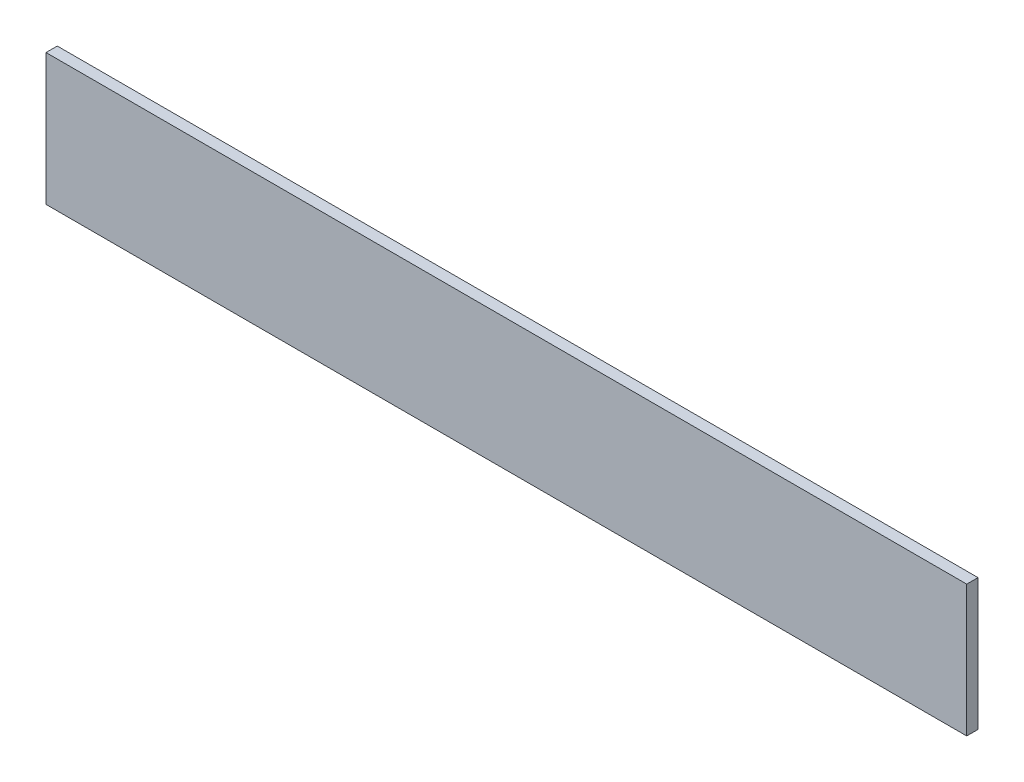
ISO-10303-21;
HEADER;
FILE_DESCRIPTION(('STEP AP214'),'2;1');
FILE_NAME('part.step','',(''),(''),'','','');
FILE_SCHEMA(('AUTOMOTIVE_DESIGN { 1 0 10303 214 1 1 1 1 }'));
ENDSEC;
DATA;
#1=APPLICATION_CONTEXT('core data for automotive mechanical design processes');
#2=APPLICATION_PROTOCOL_DEFINITION('international standard','automotive_design',2000,#1);
#3=PRODUCT_CONTEXT('',#1,'mechanical');
#4=PRODUCT('Part','Part','',(#3));
#5=PRODUCT_RELATED_PRODUCT_CATEGORY('part','',(#4));
#6=PRODUCT_DEFINITION_FORMATION('','',#4);
#7=PRODUCT_DEFINITION_CONTEXT('part definition',#1,'design');
#8=PRODUCT_DEFINITION('design','',#6,#7);
#9=PRODUCT_DEFINITION_SHAPE('','',#8);
#10=(LENGTH_UNIT() NAMED_UNIT(*) SI_UNIT(.MILLI.,.METRE.));
#11=(NAMED_UNIT(*) PLANE_ANGLE_UNIT() SI_UNIT($,.RADIAN.));
#12=(NAMED_UNIT(*) SI_UNIT($,.STERADIAN.) SOLID_ANGLE_UNIT());
#13=UNCERTAINTY_MEASURE_WITH_UNIT(LENGTH_MEASURE(1.E-05),#10,'distance_accuracy_value','');
#14=(GEOMETRIC_REPRESENTATION_CONTEXT(3) GLOBAL_UNCERTAINTY_ASSIGNED_CONTEXT((#13)) GLOBAL_UNIT_ASSIGNED_CONTEXT((#10,
#11,#12)) REPRESENTATION_CONTEXT('',''));
#15=CARTESIAN_POINT('',(0.,0.,0.));
#16=DIRECTION('',(0.,0.,1.));
#17=DIRECTION('',(1.,0.,0.));
#18=AXIS2_PLACEMENT_3D('',#15,#16,#17);
#19=CARTESIAN_POINT('',(0.,0.,3.));
#20=DIRECTION('',(-1.,0.,0.));
#21=DIRECTION('',(0.,-1.,0.));
#22=AXIS2_PLACEMENT_3D('',#19,#20,#21);
#23=PLANE('',#22);
#24=DIRECTION('',(0.,1.,0.));
#25=VECTOR('',#24,1.);
#26=CARTESIAN_POINT('',(0.,0.,0.));
#27=LINE('',#26,#25);
#28=CARTESIAN_POINT('',(0.,-35.,0.));
#29=VERTEX_POINT('',#28);
#30=CARTESIAN_POINT('',(0.,0.,0.));
#31=VERTEX_POINT('',#30);
#32=EDGE_CURVE('E100',#29,#31,#27,.T.);
#33=ORIENTED_EDGE('',*,*,#32,.T.);
#34=DIRECTION('',(0.,0.,-1.));
#35=VECTOR('',#34,1.);
#36=CARTESIAN_POINT('',(0.,0.,3.));
#37=LINE('',#36,#35);
#38=CARTESIAN_POINT('',(0.,0.,3.));
#39=VERTEX_POINT('',#38);
#40=EDGE_CURVE('E11',#39,#31,#37,.T.);
#41=ORIENTED_EDGE('',*,*,#40,.F.);
#42=DIRECTION('',(0.,1.,0.));
#43=VECTOR('',#42,1.);
#44=CARTESIAN_POINT('',(0.,0.,3.));
#45=LINE('',#44,#43);
#46=CARTESIAN_POINT('',(0.,-35.,3.));
#47=VERTEX_POINT('',#46);
#48=EDGE_CURVE('E88',#47,#39,#45,.T.);
#49=ORIENTED_EDGE('',*,*,#48,.F.);
#50=DIRECTION('',(0.,0.,-1.));
#51=VECTOR('',#50,1.);
#52=CARTESIAN_POINT('',(0.,-35.,3.));
#53=LINE('',#52,#51);
#54=EDGE_CURVE('E96',#47,#29,#53,.T.);
#55=ORIENTED_EDGE('',*,*,#54,.T.);
#56=EDGE_LOOP('',(#33,#41,#49,#55));
#57=FACE_BOUND('',#56,.T.);
#58=ADVANCED_FACE('F37',(#57),#23,.F.);
#59=CARTESIAN_POINT('',(0.,0.,3.));
#60=DIRECTION('',(0.,-1.,0.));
#61=DIRECTION('',(1.,0.,0.));
#62=AXIS2_PLACEMENT_3D('',#59,#60,#61);
#63=PLANE('',#62);
#64=DIRECTION('',(-1.,0.,0.));
#65=VECTOR('',#64,1.);
#66=CARTESIAN_POINT('',(0.,0.,0.));
#67=LINE('',#66,#65);
#68=CARTESIAN_POINT('',(-245.,0.,0.));
#69=VERTEX_POINT('',#68);
#70=EDGE_CURVE('E92',#31,#69,#67,.T.);
#71=ORIENTED_EDGE('',*,*,#70,.T.);
#72=DIRECTION('',(0.,0.,-1.));
#73=VECTOR('',#72,1.);
#74=CARTESIAN_POINT('',(-245.,0.,3.));
#75=LINE('',#74,#73);
#76=CARTESIAN_POINT('',(-245.,0.,3.));
#77=VERTEX_POINT('',#76);
#78=EDGE_CURVE('E45',#77,#69,#75,.T.);
#79=ORIENTED_EDGE('',*,*,#78,.F.);
#80=DIRECTION('',(-1.,0.,0.));
#81=VECTOR('',#80,1.);
#82=CARTESIAN_POINT('',(0.,0.,3.));
#83=LINE('',#82,#81);
#84=EDGE_CURVE('E83',#39,#77,#83,.T.);
#85=ORIENTED_EDGE('',*,*,#84,.F.);
#86=ORIENTED_EDGE('',*,*,#40,.T.);
#87=EDGE_LOOP('',(#71,#79,#85,#86));
#88=FACE_BOUND('',#87,.T.);
#89=ADVANCED_FACE('F91',(#88),#63,.F.);
#90=CARTESIAN_POINT('',(-245.,0.,3.));
#91=DIRECTION('',(1.,0.,0.));
#92=DIRECTION('',(0.,0.,-1.));
#93=AXIS2_PLACEMENT_3D('',#90,#91,#92);
#94=PLANE('',#93);
#95=DIRECTION('',(0.,-1.,0.));
#96=VECTOR('',#95,1.);
#97=CARTESIAN_POINT('',(-245.,0.,0.));
#98=LINE('',#97,#96);
#99=CARTESIAN_POINT('',(-245.,-35.,0.));
#100=VERTEX_POINT('',#99);
#101=EDGE_CURVE('E70',#69,#100,#98,.T.);
#102=ORIENTED_EDGE('',*,*,#101,.T.);
#103=DIRECTION('',(0.,0.,-1.));
#104=VECTOR('',#103,1.);
#105=CARTESIAN_POINT('',(-245.,-35.,3.));
#106=LINE('',#105,#104);
#107=CARTESIAN_POINT('',(-245.,-35.,3.));
#108=VERTEX_POINT('',#107);
#109=EDGE_CURVE('E93',#108,#100,#106,.T.);
#110=ORIENTED_EDGE('',*,*,#109,.F.);
#111=DIRECTION('',(0.,-1.,0.));
#112=VECTOR('',#111,1.);
#113=CARTESIAN_POINT('',(-245.,0.,3.));
#114=LINE('',#113,#112);
#115=EDGE_CURVE('E86',#77,#108,#114,.T.);
#116=ORIENTED_EDGE('',*,*,#115,.F.);
#117=ORIENTED_EDGE('',*,*,#78,.T.);
#118=EDGE_LOOP('',(#102,#110,#116,#117));
#119=FACE_BOUND('',#118,.T.);
#120=ADVANCED_FACE('F94',(#119),#94,.F.);
#121=CARTESIAN_POINT('',(0.,-35.,3.));
#122=DIRECTION('',(0.,1.,0.));
#123=DIRECTION('',(-1.,0.,0.));
#124=AXIS2_PLACEMENT_3D('',#121,#122,#123);
#125=PLANE('',#124);
#126=DIRECTION('',(1.,0.,0.));
#127=VECTOR('',#126,1.);
#128=CARTESIAN_POINT('',(0.,-35.,0.));
#129=LINE('',#128,#127);
#130=EDGE_CURVE('E76',#100,#29,#129,.T.);
#131=ORIENTED_EDGE('',*,*,#130,.T.);
#132=ORIENTED_EDGE('',*,*,#54,.F.);
#133=DIRECTION('',(1.,0.,0.));
#134=VECTOR('',#133,1.);
#135=CARTESIAN_POINT('',(0.,-35.,3.));
#136=LINE('',#135,#134);
#137=EDGE_CURVE('E53',#108,#47,#136,.T.);
#138=ORIENTED_EDGE('',*,*,#137,.F.);
#139=ORIENTED_EDGE('',*,*,#109,.T.);
#140=EDGE_LOOP('',(#131,#132,#138,#139));
#141=FACE_BOUND('',#140,.T.);
#142=ADVANCED_FACE('F107',(#141),#125,.F.);
#143=CARTESIAN_POINT('',(0.,0.,3.));
#144=DIRECTION('',(0.,0.,-1.));
#145=DIRECTION('',(-1.,0.,0.));
#146=AXIS2_PLACEMENT_3D('',#143,#144,#145);
#147=PLANE('',#146);
#148=ORIENTED_EDGE('',*,*,#48,.T.);
#149=ORIENTED_EDGE('',*,*,#84,.T.);
#150=ORIENTED_EDGE('',*,*,#115,.T.);
#151=ORIENTED_EDGE('',*,*,#137,.T.);
#152=EDGE_LOOP('',(#148,#149,#150,#151));
#153=FACE_BOUND('',#152,.T.);
#154=ADVANCED_FACE('F84',(#153),#147,.F.);
#155=CARTESIAN_POINT('',(0.,0.,0.));
#156=DIRECTION('',(0.,0.,-1.));
#157=DIRECTION('',(-1.,0.,0.));
#158=AXIS2_PLACEMENT_3D('',#155,#156,#157);
#159=PLANE('',#158);
#160=ORIENTED_EDGE('',*,*,#32,.F.);
#161=ORIENTED_EDGE('',*,*,#130,.F.);
#162=ORIENTED_EDGE('',*,*,#101,.F.);
#163=ORIENTED_EDGE('',*,*,#70,.F.);
#164=EDGE_LOOP('',(#160,#161,#162,#163));
#165=FACE_BOUND('',#164,.T.);
#166=ADVANCED_FACE('F110',(#165),#159,.T.);
#167=CLOSED_SHELL('',(#58,#89,#120,#142,#154,#166));
#168=MANIFOLD_SOLID_BREP('B2',#167);
#169=ADVANCED_BREP_SHAPE_REPRESENTATION('',(#18,#168),#14);
#170=SHAPE_DEFINITION_REPRESENTATION(#9,#169);
ENDSEC;
END-ISO-10303-21;
